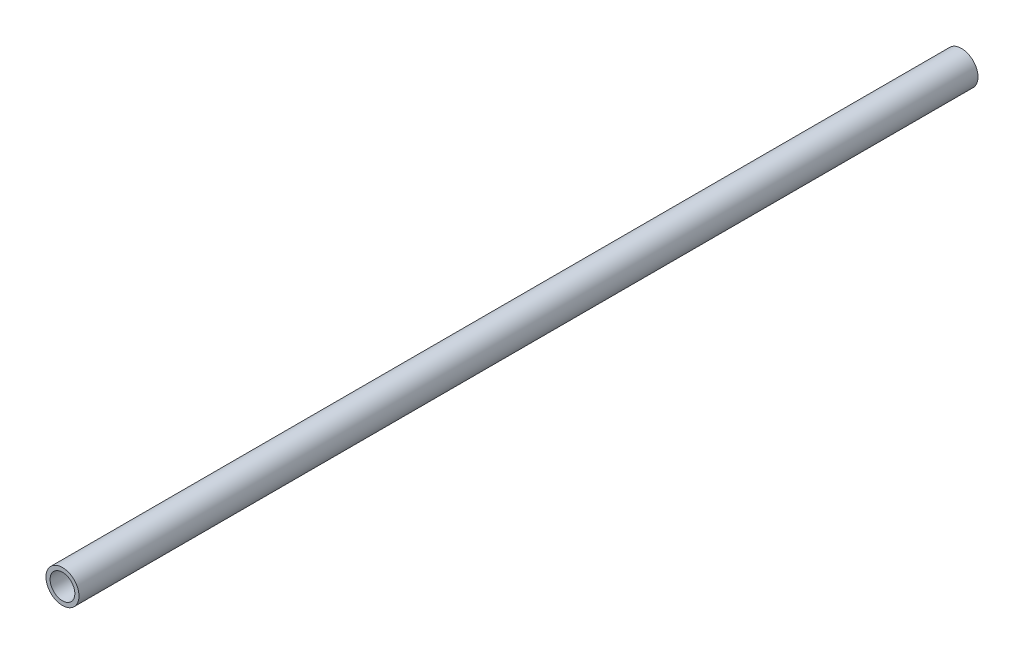
ISO-10303-21;
HEADER;
FILE_DESCRIPTION(('STEP AP214'),'2;1');
FILE_NAME('part.step','',(''),(''),'','','');
FILE_SCHEMA(('AUTOMOTIVE_DESIGN { 1 0 10303 214 1 1 1 1 }'));
ENDSEC;
DATA;
#1=APPLICATION_CONTEXT('core data for automotive mechanical design processes');
#2=APPLICATION_PROTOCOL_DEFINITION('international standard','automotive_design',2000,#1);
#3=PRODUCT_CONTEXT('',#1,'mechanical');
#4=PRODUCT('Part','Part','',(#3));
#5=PRODUCT_RELATED_PRODUCT_CATEGORY('part','',(#4));
#6=PRODUCT_DEFINITION_FORMATION('','',#4);
#7=PRODUCT_DEFINITION_CONTEXT('part definition',#1,'design');
#8=PRODUCT_DEFINITION('design','',#6,#7);
#9=PRODUCT_DEFINITION_SHAPE('','',#8);
#10=(LENGTH_UNIT() NAMED_UNIT(*) SI_UNIT(.MILLI.,.METRE.));
#11=(NAMED_UNIT(*) PLANE_ANGLE_UNIT() SI_UNIT($,.RADIAN.));
#12=(NAMED_UNIT(*) SI_UNIT($,.STERADIAN.) SOLID_ANGLE_UNIT());
#13=UNCERTAINTY_MEASURE_WITH_UNIT(LENGTH_MEASURE(1.E-05),#10,'distance_accuracy_value','');
#14=(GEOMETRIC_REPRESENTATION_CONTEXT(3) GLOBAL_UNCERTAINTY_ASSIGNED_CONTEXT((#13)) GLOBAL_UNIT_ASSIGNED_CONTEXT((#10,
#11,#12)) REPRESENTATION_CONTEXT('',''));
#15=CARTESIAN_POINT('',(0.,0.,0.));
#16=DIRECTION('',(0.,0.,1.));
#17=DIRECTION('',(1.,0.,0.));
#18=AXIS2_PLACEMENT_3D('',#15,#16,#17);
#19=CARTESIAN_POINT('',(0.,0.,218.));
#20=DIRECTION('',(0.,0.,1.));
#21=DIRECTION('',(1.,0.,0.));
#22=AXIS2_PLACEMENT_3D('',#19,#20,#21);
#23=PLANE('',#22);
#24=CARTESIAN_POINT('',(0.,0.,218.));
#25=DIRECTION('',(0.,0.,1.));
#26=DIRECTION('',(1.,0.,0.));
#27=AXIS2_PLACEMENT_3D('',#24,#25,#26);
#28=CIRCLE('',#27,4.);
#29=CARTESIAN_POINT('',(4.,0.,218.));
#30=VERTEX_POINT('',#29);
#31=EDGE_CURVE('E11',#30,#30,#28,.T.);
#32=ORIENTED_EDGE('',*,*,#31,.T.);
#33=EDGE_LOOP('',(#32));
#34=FACE_BOUND('',#33,.T.);
#35=CARTESIAN_POINT('',(0.,0.,218.));
#36=DIRECTION('',(0.,0.,1.));
#37=DIRECTION('',(1.,0.,0.));
#38=AXIS2_PLACEMENT_3D('',#35,#36,#37);
#39=CIRCLE('',#38,3.);
#40=CARTESIAN_POINT('',(3.,0.,218.));
#41=VERTEX_POINT('',#40);
#42=EDGE_CURVE('E48',#41,#41,#39,.T.);
#43=ORIENTED_EDGE('',*,*,#42,.F.);
#44=EDGE_LOOP('',(#43));
#45=FACE_BOUND('',#44,.T.);
#46=ADVANCED_FACE('F37',(#34,#45),#23,.T.);
#47=CARTESIAN_POINT('',(0.,0.,0.));
#48=DIRECTION('',(0.,0.,1.));
#49=DIRECTION('',(1.,0.,0.));
#50=AXIS2_PLACEMENT_3D('',#47,#48,#49);
#51=PLANE('',#50);
#52=CARTESIAN_POINT('',(0.,0.,0.));
#53=DIRECTION('',(0.,0.,1.));
#54=DIRECTION('',(1.,0.,0.));
#55=AXIS2_PLACEMENT_3D('',#52,#53,#54);
#56=CIRCLE('',#55,4.);
#57=CARTESIAN_POINT('',(4.,0.,0.));
#58=VERTEX_POINT('',#57);
#59=EDGE_CURVE('E41',#58,#58,#56,.T.);
#60=ORIENTED_EDGE('',*,*,#59,.F.);
#61=EDGE_LOOP('',(#60));
#62=FACE_BOUND('',#61,.T.);
#63=CARTESIAN_POINT('',(0.,0.,0.));
#64=DIRECTION('',(0.,0.,1.));
#65=DIRECTION('',(1.,0.,0.));
#66=AXIS2_PLACEMENT_3D('',#63,#64,#65);
#67=CIRCLE('',#66,3.);
#68=CARTESIAN_POINT('',(3.,0.,0.));
#69=VERTEX_POINT('',#68);
#70=EDGE_CURVE('E50',#69,#69,#67,.T.);
#71=ORIENTED_EDGE('',*,*,#70,.T.);
#72=EDGE_LOOP('',(#71));
#73=FACE_BOUND('',#72,.T.);
#74=ADVANCED_FACE('F60',(#62,#73),#51,.F.);
#75=CARTESIAN_POINT('',(0.,0.,218.));
#76=DIRECTION('',(0.,0.,-1.));
#77=DIRECTION('',(-1.,0.,0.));
#78=AXIS2_PLACEMENT_3D('',#75,#76,#77);
#79=CYLINDRICAL_SURFACE('',#78,4.);
#80=ORIENTED_EDGE('',*,*,#31,.F.);
#81=EDGE_LOOP('',(#80));
#82=FACE_BOUND('',#81,.T.);
#83=ORIENTED_EDGE('',*,*,#59,.T.);
#84=EDGE_LOOP('',(#83));
#85=FACE_BOUND('',#84,.T.);
#86=ADVANCED_FACE('F39',(#82,#85),#79,.T.);
#87=CARTESIAN_POINT('',(0.,0.,218.));
#88=DIRECTION('',(0.,0.,-1.));
#89=DIRECTION('',(-1.,0.,0.));
#90=AXIS2_PLACEMENT_3D('',#87,#88,#89);
#91=CYLINDRICAL_SURFACE('',#90,3.);
#92=ORIENTED_EDGE('',*,*,#42,.T.);
#93=EDGE_LOOP('',(#92));
#94=FACE_BOUND('',#93,.T.);
#95=ORIENTED_EDGE('',*,*,#70,.F.);
#96=EDGE_LOOP('',(#95));
#97=FACE_BOUND('',#96,.T.);
#98=ADVANCED_FACE('F56',(#94,#97),#91,.F.);
#99=CLOSED_SHELL('',(#46,#74,#86,#98));
#100=MANIFOLD_SOLID_BREP('B2',#99);
#101=ADVANCED_BREP_SHAPE_REPRESENTATION('',(#18,#100),#14);
#102=SHAPE_DEFINITION_REPRESENTATION(#9,#101);
ENDSEC;
END-ISO-10303-21;
